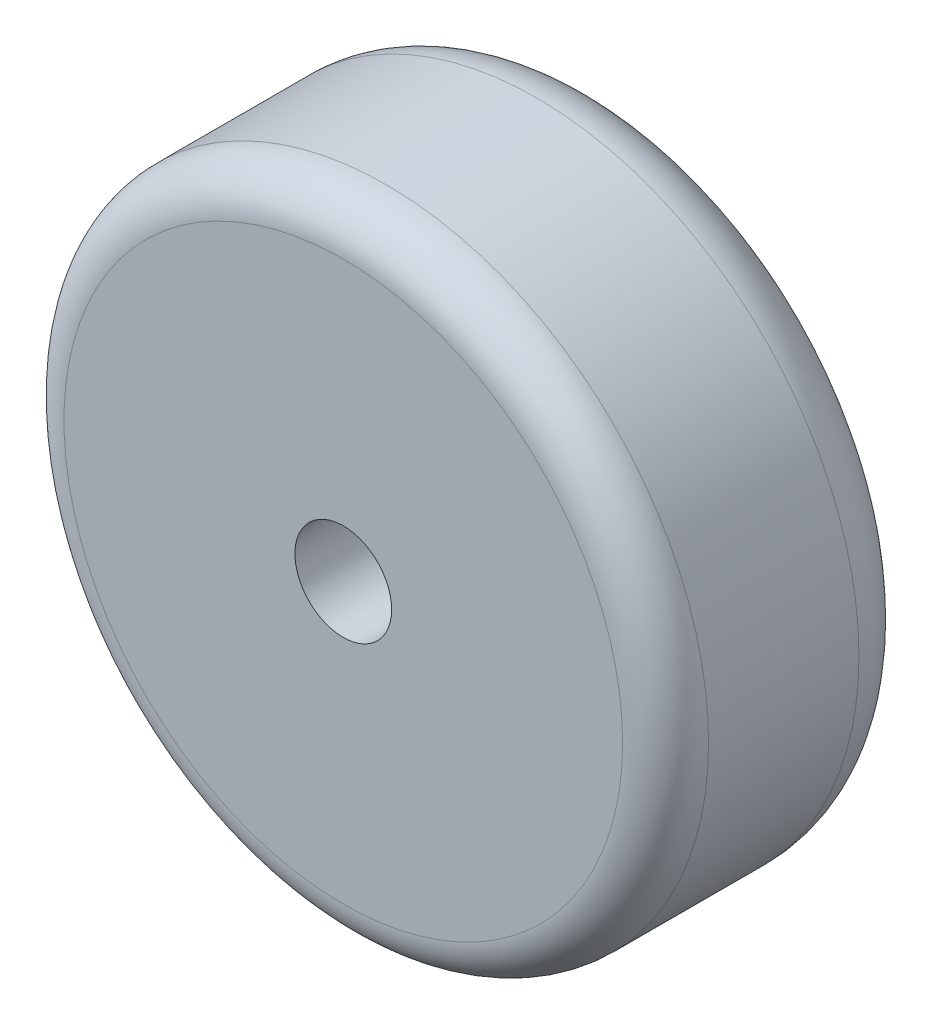
ISO-10303-21;
HEADER;
FILE_DESCRIPTION(('STEP AP214'),'2;1');
FILE_NAME('part.step','',(''),(''),'','','');
FILE_SCHEMA(('AUTOMOTIVE_DESIGN { 1 0 10303 214 1 1 1 1 }'));
ENDSEC;
DATA;
#1=APPLICATION_CONTEXT('core data for automotive mechanical design processes');
#2=APPLICATION_PROTOCOL_DEFINITION('international standard','automotive_design',2000,#1);
#3=PRODUCT_CONTEXT('',#1,'mechanical');
#4=PRODUCT('Part','Part','',(#3));
#5=PRODUCT_RELATED_PRODUCT_CATEGORY('part','',(#4));
#6=PRODUCT_DEFINITION_FORMATION('','',#4);
#7=PRODUCT_DEFINITION_CONTEXT('part definition',#1,'design');
#8=PRODUCT_DEFINITION('design','',#6,#7);
#9=PRODUCT_DEFINITION_SHAPE('','',#8);
#10=(LENGTH_UNIT() NAMED_UNIT(*) SI_UNIT(.MILLI.,.METRE.));
#11=(NAMED_UNIT(*) PLANE_ANGLE_UNIT() SI_UNIT($,.RADIAN.));
#12=(NAMED_UNIT(*) SI_UNIT($,.STERADIAN.) SOLID_ANGLE_UNIT());
#13=UNCERTAINTY_MEASURE_WITH_UNIT(LENGTH_MEASURE(1.E-05),#10,'distance_accuracy_value','');
#14=(GEOMETRIC_REPRESENTATION_CONTEXT(3) GLOBAL_UNCERTAINTY_ASSIGNED_CONTEXT((#13)) GLOBAL_UNIT_ASSIGNED_CONTEXT((#10,
#11,#12)) REPRESENTATION_CONTEXT('',''));
#15=CARTESIAN_POINT('',(0.,0.,0.));
#16=DIRECTION('',(0.,0.,1.));
#17=DIRECTION('',(1.,0.,0.));
#18=AXIS2_PLACEMENT_3D('',#15,#16,#17);
#19=CARTESIAN_POINT('',(0.,0.,12.));
#20=DIRECTION('',(0.,0.,1.));
#21=DIRECTION('',(1.,0.,0.));
#22=AXIS2_PLACEMENT_3D('',#19,#20,#21);
#23=PLANE('',#22);
#24=CARTESIAN_POINT('',(0.,0.,12.));
#25=DIRECTION('',(0.,0.,1.));
#26=DIRECTION('',(1.,0.,0.));
#27=AXIS2_PLACEMENT_3D('',#24,#25,#26);
#28=CIRCLE('',#27,13.);
#29=CARTESIAN_POINT('',(13.,0.,12.));
#30=VERTEX_POINT('',#29);
#31=EDGE_CURVE('E46',#30,#30,#28,.T.);
#32=ORIENTED_EDGE('',*,*,#31,.T.);
#33=EDGE_LOOP('',(#32));
#34=FACE_BOUND('',#33,.T.);
#35=CARTESIAN_POINT('',(0.,0.,12.));
#36=DIRECTION('',(0.,0.,1.));
#37=DIRECTION('',(1.,0.,0.));
#38=AXIS2_PLACEMENT_3D('',#35,#36,#37);
#39=CIRCLE('',#38,2.25);
#40=CARTESIAN_POINT('',(2.25,0.,12.));
#41=VERTEX_POINT('',#40);
#42=EDGE_CURVE('E51',#41,#41,#39,.T.);
#43=ORIENTED_EDGE('',*,*,#42,.F.);
#44=EDGE_LOOP('',(#43));
#45=FACE_BOUND('',#44,.T.);
#46=ADVANCED_FACE('F31',(#34,#45),#23,.T.);
#47=CARTESIAN_POINT('',(0.,0.,0.));
#48=DIRECTION('',(0.,0.,1.));
#49=DIRECTION('',(1.,0.,0.));
#50=AXIS2_PLACEMENT_3D('',#47,#48,#49);
#51=PLANE('',#50);
#52=CARTESIAN_POINT('',(0.,0.,0.));
#53=DIRECTION('',(0.,0.,1.));
#54=DIRECTION('',(1.,0.,0.));
#55=AXIS2_PLACEMENT_3D('',#52,#53,#54);
#56=CIRCLE('',#55,12.);
#57=CARTESIAN_POINT('',(12.,0.,0.));
#58=VERTEX_POINT('',#57);
#59=EDGE_CURVE('E10',#58,#58,#56,.F.);
#60=ORIENTED_EDGE('',*,*,#59,.T.);
#61=EDGE_LOOP('',(#60));
#62=FACE_BOUND('',#61,.T.);
#63=CARTESIAN_POINT('',(0.,0.,0.));
#64=DIRECTION('',(0.,0.,1.));
#65=DIRECTION('',(1.,0.,0.));
#66=AXIS2_PLACEMENT_3D('',#63,#64,#65);
#67=CIRCLE('',#66,2.25);
#68=CARTESIAN_POINT('',(2.25,0.,0.));
#69=VERTEX_POINT('',#68);
#70=EDGE_CURVE('E52',#69,#69,#67,.T.);
#71=ORIENTED_EDGE('',*,*,#70,.T.);
#72=EDGE_LOOP('',(#71));
#73=FACE_BOUND('',#72,.T.);
#74=ADVANCED_FACE('F62',(#62,#73),#51,.F.);
#75=CARTESIAN_POINT('',(0.,0.,12.));
#76=DIRECTION('',(0.,0.,-1.));
#77=DIRECTION('',(-1.,0.,0.));
#78=AXIS2_PLACEMENT_3D('',#75,#76,#77);
#79=CYLINDRICAL_SURFACE('',#78,15.);
#80=CARTESIAN_POINT('',(0.,0.,3.));
#81=DIRECTION('',(0.,0.,1.));
#82=DIRECTION('',(1.,0.,0.));
#83=AXIS2_PLACEMENT_3D('',#80,#81,#82);
#84=CIRCLE('',#83,15.);
#85=CARTESIAN_POINT('',(15.,0.,3.));
#86=VERTEX_POINT('',#85);
#87=EDGE_CURVE('E38',#86,#86,#84,.T.);
#88=ORIENTED_EDGE('',*,*,#87,.T.);
#89=EDGE_LOOP('',(#88));
#90=FACE_BOUND('',#89,.T.);
#91=CARTESIAN_POINT('',(0.,0.,10.));
#92=DIRECTION('',(0.,0.,1.));
#93=DIRECTION('',(1.,0.,0.));
#94=AXIS2_PLACEMENT_3D('',#91,#92,#93);
#95=CIRCLE('',#94,15.);
#96=CARTESIAN_POINT('',(15.,0.,10.));
#97=VERTEX_POINT('',#96);
#98=EDGE_CURVE('E42',#97,#97,#95,.F.);
#99=ORIENTED_EDGE('',*,*,#98,.T.);
#100=EDGE_LOOP('',(#99));
#101=FACE_BOUND('',#100,.T.);
#102=ADVANCED_FACE('F68',(#90,#101),#79,.T.);
#103=CARTESIAN_POINT('',(0.,0.,12.));
#104=DIRECTION('',(0.,0.,-1.));
#105=DIRECTION('',(-1.,0.,0.));
#106=AXIS2_PLACEMENT_3D('',#103,#104,#105);
#107=CYLINDRICAL_SURFACE('',#106,2.25);
#108=ORIENTED_EDGE('',*,*,#42,.T.);
#109=EDGE_LOOP('',(#108));
#110=FACE_BOUND('',#109,.T.);
#111=ORIENTED_EDGE('',*,*,#70,.F.);
#112=EDGE_LOOP('',(#111));
#113=FACE_BOUND('',#112,.T.);
#114=ADVANCED_FACE('F58',(#110,#113),#107,.F.);
#115=CARTESIAN_POINT('',(0.,0.,10.));
#116=DIRECTION('',(0.,0.,1.));
#117=DIRECTION('',(1.,0.,0.));
#118=AXIS2_PLACEMENT_3D('',#115,#116,#117);
#119=TOROIDAL_SURFACE('',#118,13.,2.);
#120=ORIENTED_EDGE('',*,*,#98,.F.);
#121=EDGE_LOOP('',(#120));
#122=FACE_BOUND('',#121,.T.);
#123=ORIENTED_EDGE('',*,*,#31,.F.);
#124=EDGE_LOOP('',(#123));
#125=FACE_BOUND('',#124,.T.);
#126=ADVANCED_FACE('F73',(#122,#125),#119,.T.);
#127=CARTESIAN_POINT('',(0.,0.,3.));
#128=DIRECTION('',(0.,0.,1.));
#129=DIRECTION('',(1.,0.,0.));
#130=AXIS2_PLACEMENT_3D('',#127,#128,#129);
#131=TOROIDAL_SURFACE('',#130,12.,3.);
#132=ORIENTED_EDGE('',*,*,#59,.F.);
#133=EDGE_LOOP('',(#132));
#134=FACE_BOUND('',#133,.T.);
#135=ORIENTED_EDGE('',*,*,#87,.F.);
#136=EDGE_LOOP('',(#135));
#137=FACE_BOUND('',#136,.T.);
#138=ADVANCED_FACE('F33',(#134,#137),#131,.T.);
#139=CLOSED_SHELL('',(#46,#74,#102,#114,#126,#138));
#140=MANIFOLD_SOLID_BREP('B2',#139);
#141=ADVANCED_BREP_SHAPE_REPRESENTATION('',(#18,#140),#14);
#142=SHAPE_DEFINITION_REPRESENTATION(#9,#141);
ENDSEC;
END-ISO-10303-21;
